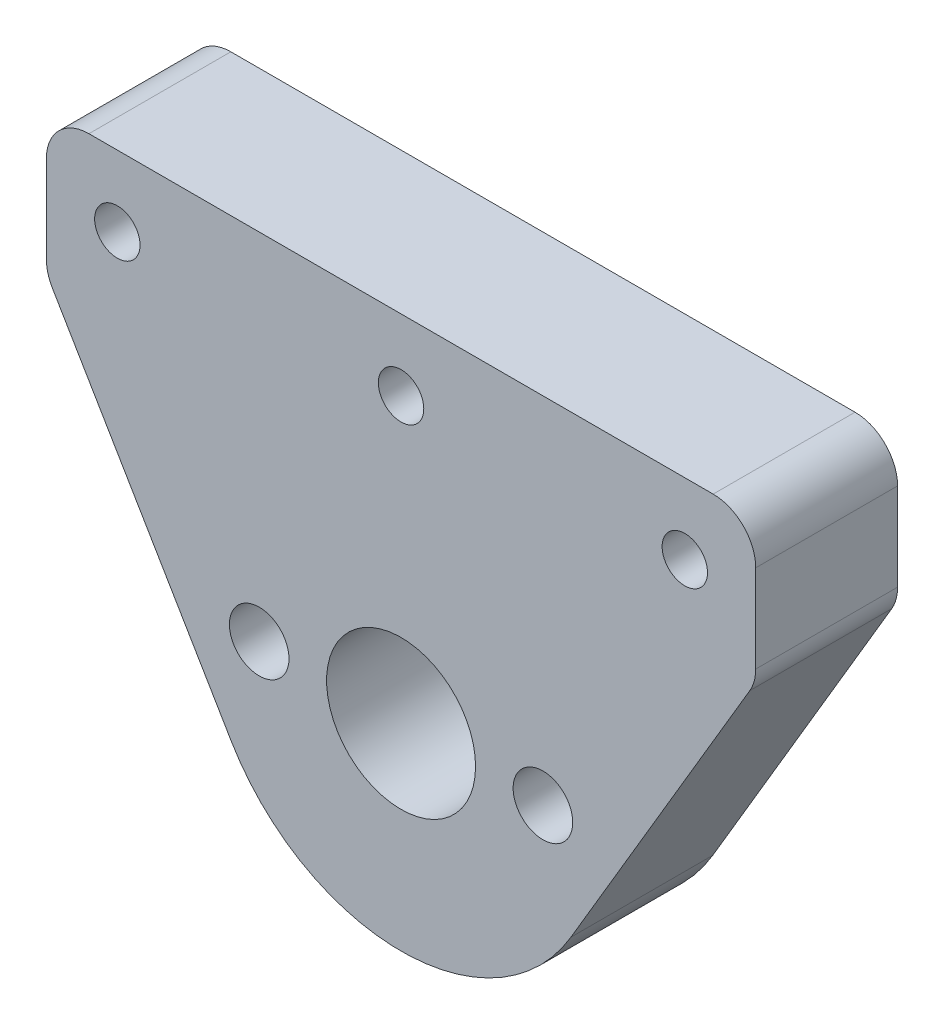
ISO-10303-21;
HEADER;
FILE_DESCRIPTION(('STEP AP214'),'2;1');
FILE_NAME('part.step','',(''),(''),'','','');
FILE_SCHEMA(('AUTOMOTIVE_DESIGN { 1 0 10303 214 1 1 1 1 }'));
ENDSEC;
DATA;
#1=APPLICATION_CONTEXT('core data for automotive mechanical design processes');
#2=APPLICATION_PROTOCOL_DEFINITION('international standard','automotive_design',2000,#1);
#3=PRODUCT_CONTEXT('',#1,'mechanical');
#4=PRODUCT('Part','Part','',(#3));
#5=PRODUCT_RELATED_PRODUCT_CATEGORY('part','',(#4));
#6=PRODUCT_DEFINITION_FORMATION('','',#4);
#7=PRODUCT_DEFINITION_CONTEXT('part definition',#1,'design');
#8=PRODUCT_DEFINITION('design','',#6,#7);
#9=PRODUCT_DEFINITION_SHAPE('','',#8);
#10=(LENGTH_UNIT() NAMED_UNIT(*) SI_UNIT(.MILLI.,.METRE.));
#11=(NAMED_UNIT(*) PLANE_ANGLE_UNIT() SI_UNIT($,.RADIAN.));
#12=(NAMED_UNIT(*) SI_UNIT($,.STERADIAN.) SOLID_ANGLE_UNIT());
#13=UNCERTAINTY_MEASURE_WITH_UNIT(LENGTH_MEASURE(1.E-05),#10,'distance_accuracy_value','');
#14=(GEOMETRIC_REPRESENTATION_CONTEXT(3) GLOBAL_UNCERTAINTY_ASSIGNED_CONTEXT((#13)) GLOBAL_UNIT_ASSIGNED_CONTEXT((#10,
#11,#12)) REPRESENTATION_CONTEXT('',''));
#15=CARTESIAN_POINT('',(0.,0.,0.));
#16=DIRECTION('',(0.,0.,1.));
#17=DIRECTION('',(1.,0.,0.));
#18=AXIS2_PLACEMENT_3D('',#15,#16,#17);
#19=CARTESIAN_POINT('',(0.,-20.,10.));
#20=DIRECTION('',(0.,0.,-1.));
#21=DIRECTION('',(-1.,0.,0.));
#22=AXIS2_PLACEMENT_3D('',#19,#20,#21);
#23=CYLINDRICAL_SURFACE('',#22,13.9);
#24=CARTESIAN_POINT('',(0.,-20.,0.));
#25=DIRECTION('',(0.,0.,1.));
#26=DIRECTION('',(1.,0.,0.));
#27=AXIS2_PLACEMENT_3D('',#24,#25,#26);
#28=CIRCLE('',#27,13.9);
#29=CARTESIAN_POINT('',(-11.9690237254858,-27.067706209143,0.));
#30=VERTEX_POINT('',#29);
#31=CARTESIAN_POINT('',(11.9690237254858,-27.067706209143,0.));
#32=VERTEX_POINT('',#31);
#33=EDGE_CURVE('E146',#30,#32,#28,.T.);
#34=ORIENTED_EDGE('',*,*,#33,.T.);
#35=DIRECTION('',(0.,0.,-1.));
#36=VECTOR('',#35,1.);
#37=CARTESIAN_POINT('',(11.9690237254858,-27.067706209143,10.));
#38=LINE('',#37,#36);
#39=CARTESIAN_POINT('',(11.9690237254858,-27.067706209143,10.));
#40=VERTEX_POINT('',#39);
#41=EDGE_CURVE('E125',#40,#32,#38,.T.);
#42=ORIENTED_EDGE('',*,*,#41,.F.);
#43=CARTESIAN_POINT('',(0.,-20.,10.));
#44=DIRECTION('',(0.,0.,1.));
#45=DIRECTION('',(1.,0.,0.));
#46=AXIS2_PLACEMENT_3D('',#43,#44,#45);
#47=CIRCLE('',#46,13.9);
#48=CARTESIAN_POINT('',(-11.9690237254858,-27.067706209143,10.));
#49=VERTEX_POINT('',#48);
#50=EDGE_CURVE('E131',#49,#40,#47,.T.);
#51=ORIENTED_EDGE('',*,*,#50,.F.);
#52=DIRECTION('',(0.,0.,-1.));
#53=VECTOR('',#52,1.);
#54=CARTESIAN_POINT('',(-11.9690237254858,-27.067706209143,10.));
#55=LINE('',#54,#53);
#56=EDGE_CURVE('E149',#49,#30,#55,.T.);
#57=ORIENTED_EDGE('',*,*,#56,.T.);
#58=EDGE_LOOP('',(#34,#42,#51,#57));
#59=FACE_BOUND('',#58,.T.);
#60=ADVANCED_FACE('F41',(#59),#23,.T.);
#61=CARTESIAN_POINT('',(20.7256660630455,-12.2385018262184,10.));
#62=DIRECTION('',(0.861080843560131,-0.50846807260021,0.));
#63=DIRECTION('',(0.50846807260021,0.861080843560131,0.));
#64=AXIS2_PLACEMENT_3D('',#61,#62,#63);
#65=PLANE('',#64);
#66=DIRECTION('',(-0.50846807260021,-0.861080843560131,0.));
#67=VECTOR('',#66,1.);
#68=CARTESIAN_POINT('',(20.7256660630455,-12.2385018262184,0.));
#69=LINE('',#68,#67);
#70=CARTESIAN_POINT('',(24.5832425306803,-5.70577071123963,0.));
#71=VERTEX_POINT('',#70);
#72=EDGE_CURVE('E229',#71,#32,#69,.T.);
#73=ORIENTED_EDGE('',*,*,#72,.F.);
#74=DIRECTION('',(0.,0.,-1.));
#75=VECTOR('',#74,1.);
#76=CARTESIAN_POINT('',(24.5832425306803,-5.70577071123963,10.));
#77=LINE('',#76,#75);
#78=CARTESIAN_POINT('',(24.5832425306803,-5.70577071123963,10.));
#79=VERTEX_POINT('',#78);
#80=EDGE_CURVE('E11',#71,#79,#77,.F.);
#81=ORIENTED_EDGE('',*,*,#80,.T.);
#82=DIRECTION('',(-0.50846807260021,-0.861080843560131,0.));
#83=VECTOR('',#82,1.);
#84=CARTESIAN_POINT('',(20.7256660630455,-12.2385018262184,10.));
#85=LINE('',#84,#83);
#86=EDGE_CURVE('E120',#79,#40,#85,.T.);
#87=ORIENTED_EDGE('',*,*,#86,.T.);
#88=ORIENTED_EDGE('',*,*,#41,.T.);
#89=EDGE_LOOP('',(#73,#81,#87,#88));
#90=FACE_BOUND('',#89,.T.);
#91=ADVANCED_FACE('F123',(#90),#65,.T.);
#92=CARTESIAN_POINT('',(24.9999999999999,0.,10.));
#93=DIRECTION('',(1.,0.,0.));
#94=DIRECTION('',(0.,1.,0.));
#95=AXIS2_PLACEMENT_3D('',#92,#93,#94);
#96=PLANE('',#95);
#97=DIRECTION('',(0.,-1.,0.));
#98=VECTOR('',#97,1.);
#99=CARTESIAN_POINT('',(24.9999999999999,0.,0.));
#100=LINE('',#99,#98);
#101=CARTESIAN_POINT('',(24.9999999999999,2.,0.));
#102=VERTEX_POINT('',#101);
#103=CARTESIAN_POINT('',(24.9999999999999,-4.180366493439,0.));
#104=VERTEX_POINT('',#103);
#105=EDGE_CURVE('E206',#102,#104,#100,.T.);
#106=ORIENTED_EDGE('',*,*,#105,.F.);
#107=DIRECTION('',(0.,0.,-1.));
#108=VECTOR('',#107,1.);
#109=CARTESIAN_POINT('',(24.9999999999999,2.,10.));
#110=LINE('',#109,#108);
#111=CARTESIAN_POINT('',(24.9999999999999,2.,10.));
#112=VERTEX_POINT('',#111);
#113=EDGE_CURVE('E50',#102,#112,#110,.F.);
#114=ORIENTED_EDGE('',*,*,#113,.T.);
#115=DIRECTION('',(0.,-1.,0.));
#116=VECTOR('',#115,1.);
#117=CARTESIAN_POINT('',(24.9999999999999,0.,10.));
#118=LINE('',#117,#116);
#119=CARTESIAN_POINT('',(24.9999999999999,-4.180366493439,10.));
#120=VERTEX_POINT('',#119);
#121=EDGE_CURVE('E130',#112,#120,#118,.T.);
#122=ORIENTED_EDGE('',*,*,#121,.T.);
#123=DIRECTION('',(0.,0.,-1.));
#124=VECTOR('',#123,1.);
#125=CARTESIAN_POINT('',(24.9999999999999,-4.180366493439,10.));
#126=LINE('',#125,#124);
#127=EDGE_CURVE('E195',#120,#104,#126,.T.);
#128=ORIENTED_EDGE('',*,*,#127,.T.);
#129=EDGE_LOOP('',(#106,#114,#122,#128));
#130=FACE_BOUND('',#129,.T.);
#131=ADVANCED_FACE('F203',(#130),#96,.T.);
#132=CARTESIAN_POINT('',(0.,5.,10.));
#133=DIRECTION('',(0.,-1.,0.));
#134=DIRECTION('',(1.,0.,0.));
#135=AXIS2_PLACEMENT_3D('',#132,#133,#134);
#136=PLANE('',#135);
#137=DIRECTION('',(-1.,0.,0.));
#138=VECTOR('',#137,1.);
#139=CARTESIAN_POINT('',(0.,5.,0.));
#140=LINE('',#139,#138);
#141=CARTESIAN_POINT('',(21.9999999999999,5.,0.));
#142=VERTEX_POINT('',#141);
#143=CARTESIAN_POINT('',(-22.,5.,0.));
#144=VERTEX_POINT('',#143);
#145=EDGE_CURVE('E215',#142,#144,#140,.T.);
#146=ORIENTED_EDGE('',*,*,#145,.T.);
#147=DIRECTION('',(0.,0.,-1.));
#148=VECTOR('',#147,1.);
#149=CARTESIAN_POINT('',(-22.,5.,10.));
#150=LINE('',#149,#148);
#151=CARTESIAN_POINT('',(-22.,5.,10.));
#152=VERTEX_POINT('',#151);
#153=EDGE_CURVE('E57',#144,#152,#150,.F.);
#154=ORIENTED_EDGE('',*,*,#153,.T.);
#155=DIRECTION('',(-1.,0.,0.));
#156=VECTOR('',#155,1.);
#157=CARTESIAN_POINT('',(0.,5.,10.));
#158=LINE('',#157,#156);
#159=CARTESIAN_POINT('',(21.9999999999999,5.,10.));
#160=VERTEX_POINT('',#159);
#161=EDGE_CURVE('E209',#160,#152,#158,.T.);
#162=ORIENTED_EDGE('',*,*,#161,.F.);
#163=DIRECTION('',(0.,0.,-1.));
#164=VECTOR('',#163,1.);
#165=CARTESIAN_POINT('',(21.9999999999999,5.,0.));
#166=LINE('',#165,#164);
#167=EDGE_CURVE('E189',#160,#142,#166,.T.);
#168=ORIENTED_EDGE('',*,*,#167,.T.);
#169=EDGE_LOOP('',(#146,#154,#162,#168));
#170=FACE_BOUND('',#169,.T.);
#171=ADVANCED_FACE('F214',(#170),#136,.F.);
#172=CARTESIAN_POINT('',(-25.,0.,10.));
#173=DIRECTION('',(1.,0.,0.));
#174=DIRECTION('',(0.,1.,0.));
#175=AXIS2_PLACEMENT_3D('',#172,#173,#174);
#176=PLANE('',#175);
#177=DIRECTION('',(0.,-1.,0.));
#178=VECTOR('',#177,1.);
#179=CARTESIAN_POINT('',(-25.,0.,0.));
#180=LINE('',#179,#178);
#181=CARTESIAN_POINT('',(-25.,2.,0.));
#182=VERTEX_POINT('',#181);
#183=CARTESIAN_POINT('',(-25.,-4.18036649343903,0.));
#184=VERTEX_POINT('',#183);
#185=EDGE_CURVE('E222',#182,#184,#180,.T.);
#186=ORIENTED_EDGE('',*,*,#185,.T.);
#187=DIRECTION('',(0.,0.,-1.));
#188=VECTOR('',#187,1.);
#189=CARTESIAN_POINT('',(-25.,-4.18036649343903,10.));
#190=LINE('',#189,#188);
#191=CARTESIAN_POINT('',(-25.,-4.18036649343903,10.));
#192=VERTEX_POINT('',#191);
#193=EDGE_CURVE('E175',#184,#192,#190,.F.);
#194=ORIENTED_EDGE('',*,*,#193,.T.);
#195=DIRECTION('',(0.,-1.,0.));
#196=VECTOR('',#195,1.);
#197=CARTESIAN_POINT('',(-25.,0.,10.));
#198=LINE('',#197,#196);
#199=CARTESIAN_POINT('',(-25.,2.,10.));
#200=VERTEX_POINT('',#199);
#201=EDGE_CURVE('E318',#200,#192,#198,.T.);
#202=ORIENTED_EDGE('',*,*,#201,.F.);
#203=DIRECTION('',(0.,0.,-1.));
#204=VECTOR('',#203,1.);
#205=CARTESIAN_POINT('',(-25.,2.,10.));
#206=LINE('',#205,#204);
#207=EDGE_CURVE('E171',#200,#182,#206,.T.);
#208=ORIENTED_EDGE('',*,*,#207,.T.);
#209=EDGE_LOOP('',(#186,#194,#202,#208));
#210=FACE_BOUND('',#209,.T.);
#211=ADVANCED_FACE('F335',(#210),#176,.F.);
#212=CARTESIAN_POINT('',(-20.,0.,10.));
#213=DIRECTION('',(0.,0.,-1.));
#214=DIRECTION('',(-1.,0.,0.));
#215=AXIS2_PLACEMENT_3D('',#212,#213,#214);
#216=CYLINDRICAL_SURFACE('',#215,1.6);
#217=CARTESIAN_POINT('',(-20.,0.,10.));
#218=DIRECTION('',(0.,0.,1.));
#219=DIRECTION('',(1.,0.,0.));
#220=AXIS2_PLACEMENT_3D('',#217,#218,#219);
#221=CIRCLE('',#220,1.6);
#222=CARTESIAN_POINT('',(-18.4,0.,10.));
#223=VERTEX_POINT('',#222);
#224=EDGE_CURVE('E300',#223,#223,#221,.T.);
#225=ORIENTED_EDGE('',*,*,#224,.T.);
#226=EDGE_LOOP('',(#225));
#227=FACE_BOUND('',#226,.T.);
#228=CARTESIAN_POINT('',(-20.,0.,0.));
#229=DIRECTION('',(0.,0.,1.));
#230=DIRECTION('',(1.,0.,0.));
#231=AXIS2_PLACEMENT_3D('',#228,#229,#230);
#232=CIRCLE('',#231,1.6);
#233=CARTESIAN_POINT('',(-18.4,0.,0.));
#234=VERTEX_POINT('',#233);
#235=EDGE_CURVE('E247',#234,#234,#232,.T.);
#236=ORIENTED_EDGE('',*,*,#235,.F.);
#237=EDGE_LOOP('',(#236));
#238=FACE_BOUND('',#237,.T.);
#239=ADVANCED_FACE('F356',(#227,#238),#216,.F.);
#240=CARTESIAN_POINT('',(0.,0.,10.));
#241=DIRECTION('',(0.,0.,-1.));
#242=DIRECTION('',(-1.,0.,0.));
#243=AXIS2_PLACEMENT_3D('',#240,#241,#242);
#244=CYLINDRICAL_SURFACE('',#243,1.6);
#245=CARTESIAN_POINT('',(0.,0.,10.));
#246=DIRECTION('',(0.,0.,1.));
#247=DIRECTION('',(1.,0.,0.));
#248=AXIS2_PLACEMENT_3D('',#245,#246,#247);
#249=CIRCLE('',#248,1.6);
#250=CARTESIAN_POINT('',(1.6,0.,10.));
#251=VERTEX_POINT('',#250);
#252=EDGE_CURVE('E304',#251,#251,#249,.T.);
#253=ORIENTED_EDGE('',*,*,#252,.T.);
#254=EDGE_LOOP('',(#253));
#255=FACE_BOUND('',#254,.T.);
#256=CARTESIAN_POINT('',(0.,0.,0.));
#257=DIRECTION('',(0.,0.,1.));
#258=DIRECTION('',(1.,0.,0.));
#259=AXIS2_PLACEMENT_3D('',#256,#257,#258);
#260=CIRCLE('',#259,1.6);
#261=CARTESIAN_POINT('',(1.6,0.,0.));
#262=VERTEX_POINT('',#261);
#263=EDGE_CURVE('E243',#262,#262,#260,.T.);
#264=ORIENTED_EDGE('',*,*,#263,.F.);
#265=EDGE_LOOP('',(#264));
#266=FACE_BOUND('',#265,.T.);
#267=ADVANCED_FACE('F377',(#255,#266),#244,.F.);
#268=CARTESIAN_POINT('',(10.,-20.,10.));
#269=DIRECTION('',(0.,0.,-1.));
#270=DIRECTION('',(-1.,0.,0.));
#271=AXIS2_PLACEMENT_3D('',#268,#269,#270);
#272=CYLINDRICAL_SURFACE('',#271,2.1);
#273=CARTESIAN_POINT('',(10.,-20.,10.));
#274=DIRECTION('',(0.,0.,1.));
#275=DIRECTION('',(1.,0.,0.));
#276=AXIS2_PLACEMENT_3D('',#273,#274,#275);
#277=CIRCLE('',#276,2.1);
#278=CARTESIAN_POINT('',(12.1,-20.,10.));
#279=VERTEX_POINT('',#278);
#280=EDGE_CURVE('E308',#279,#279,#277,.F.);
#281=ORIENTED_EDGE('',*,*,#280,.F.);
#282=EDGE_LOOP('',(#281));
#283=FACE_BOUND('',#282,.T.);
#284=CARTESIAN_POINT('',(10.,-20.,0.));
#285=DIRECTION('',(0.,0.,1.));
#286=DIRECTION('',(1.,0.,0.));
#287=AXIS2_PLACEMENT_3D('',#284,#285,#286);
#288=CIRCLE('',#287,2.1);
#289=CARTESIAN_POINT('',(12.1,-20.,0.));
#290=VERTEX_POINT('',#289);
#291=EDGE_CURVE('E239',#290,#290,#288,.F.);
#292=ORIENTED_EDGE('',*,*,#291,.T.);
#293=EDGE_LOOP('',(#292));
#294=FACE_BOUND('',#293,.T.);
#295=ADVANCED_FACE('F349',(#283,#294),#272,.F.);
#296=CARTESIAN_POINT('',(-10.,-20.,10.));
#297=DIRECTION('',(0.,0.,-1.));
#298=DIRECTION('',(-1.,0.,0.));
#299=AXIS2_PLACEMENT_3D('',#296,#297,#298);
#300=CYLINDRICAL_SURFACE('',#299,2.1);
#301=CARTESIAN_POINT('',(-10.,-20.,10.));
#302=DIRECTION('',(0.,0.,1.));
#303=DIRECTION('',(1.,0.,0.));
#304=AXIS2_PLACEMENT_3D('',#301,#302,#303);
#305=CIRCLE('',#304,2.1);
#306=CARTESIAN_POINT('',(-7.9,-20.,10.));
#307=VERTEX_POINT('',#306);
#308=EDGE_CURVE('E312',#307,#307,#305,.T.);
#309=ORIENTED_EDGE('',*,*,#308,.T.);
#310=EDGE_LOOP('',(#309));
#311=FACE_BOUND('',#310,.T.);
#312=CARTESIAN_POINT('',(-10.,-20.,0.));
#313=DIRECTION('',(0.,0.,1.));
#314=DIRECTION('',(1.,0.,0.));
#315=AXIS2_PLACEMENT_3D('',#312,#313,#314);
#316=CIRCLE('',#315,2.1);
#317=CARTESIAN_POINT('',(-7.9,-20.,0.));
#318=VERTEX_POINT('',#317);
#319=EDGE_CURVE('E235',#318,#318,#316,.T.);
#320=ORIENTED_EDGE('',*,*,#319,.F.);
#321=EDGE_LOOP('',(#320));
#322=FACE_BOUND('',#321,.T.);
#323=ADVANCED_FACE('F342',(#311,#322),#300,.F.);
#324=CARTESIAN_POINT('',(-20.7256660630455,-12.2385018262185,10.));
#325=DIRECTION('',(0.861080843560129,0.508468072600214,0.));
#326=DIRECTION('',(-0.508468072600214,0.861080843560129,0.));
#327=AXIS2_PLACEMENT_3D('',#324,#325,#326);
#328=PLANE('',#327);
#329=DIRECTION('',(0.508468072600214,-0.861080843560129,0.));
#330=VECTOR('',#329,1.);
#331=CARTESIAN_POINT('',(-20.7256660630455,-12.2385018262185,10.));
#332=LINE('',#331,#330);
#333=CARTESIAN_POINT('',(-24.5832425306804,-5.70577071123967,10.));
#334=VERTEX_POINT('',#333);
#335=EDGE_CURVE('E138',#334,#49,#332,.T.);
#336=ORIENTED_EDGE('',*,*,#335,.F.);
#337=DIRECTION('',(0.,0.,-1.));
#338=VECTOR('',#337,1.);
#339=CARTESIAN_POINT('',(-24.5832425306804,-5.70577071123967,10.));
#340=LINE('',#339,#338);
#341=CARTESIAN_POINT('',(-24.5832425306804,-5.70577071123967,0.));
#342=VERTEX_POINT('',#341);
#343=EDGE_CURVE('E148',#334,#342,#340,.T.);
#344=ORIENTED_EDGE('',*,*,#343,.T.);
#345=DIRECTION('',(0.508468072600214,-0.861080843560129,0.));
#346=VECTOR('',#345,1.);
#347=CARTESIAN_POINT('',(-20.7256660630455,-12.2385018262185,0.));
#348=LINE('',#347,#346);
#349=EDGE_CURVE('E227',#342,#30,#348,.T.);
#350=ORIENTED_EDGE('',*,*,#349,.T.);
#351=ORIENTED_EDGE('',*,*,#56,.F.);
#352=EDGE_LOOP('',(#336,#344,#350,#351));
#353=FACE_BOUND('',#352,.T.);
#354=ADVANCED_FACE('F340',(#353),#328,.F.);
#355=CARTESIAN_POINT('',(20.,0.,10.));
#356=DIRECTION('',(0.,0.,-1.));
#357=DIRECTION('',(-1.,0.,0.));
#358=AXIS2_PLACEMENT_3D('',#355,#356,#357);
#359=CYLINDRICAL_SURFACE('',#358,1.6);
#360=CARTESIAN_POINT('',(20.,0.,10.));
#361=DIRECTION('',(0.,0.,1.));
#362=DIRECTION('',(1.,0.,0.));
#363=AXIS2_PLACEMENT_3D('',#360,#361,#362);
#364=CIRCLE('',#363,1.6);
#365=CARTESIAN_POINT('',(21.6,0.,10.));
#366=VERTEX_POINT('',#365);
#367=EDGE_CURVE('E156',#366,#366,#364,.F.);
#368=ORIENTED_EDGE('',*,*,#367,.F.);
#369=EDGE_LOOP('',(#368));
#370=FACE_BOUND('',#369,.T.);
#371=CARTESIAN_POINT('',(20.,0.,0.));
#372=DIRECTION('',(0.,0.,1.));
#373=DIRECTION('',(1.,0.,0.));
#374=AXIS2_PLACEMENT_3D('',#371,#372,#373);
#375=CIRCLE('',#374,1.6);
#376=CARTESIAN_POINT('',(21.6,0.,0.));
#377=VERTEX_POINT('',#376);
#378=EDGE_CURVE('E143',#377,#377,#375,.F.);
#379=ORIENTED_EDGE('',*,*,#378,.T.);
#380=EDGE_LOOP('',(#379));
#381=FACE_BOUND('',#380,.T.);
#382=ADVANCED_FACE('F254',(#370,#381),#359,.F.);
#383=CARTESIAN_POINT('',(0.,0.,10.));
#384=DIRECTION('',(0.,0.,1.));
#385=DIRECTION('',(1.,0.,0.));
#386=AXIS2_PLACEMENT_3D('',#383,#384,#385);
#387=PLANE('',#386);
#388=CARTESIAN_POINT('',(0.,-20.,10.));
#389=DIRECTION('',(0.,0.,1.));
#390=DIRECTION('',(1.,0.,0.));
#391=AXIS2_PLACEMENT_3D('',#388,#389,#390);
#392=CIRCLE('',#391,5.25);
#393=CARTESIAN_POINT('',(5.25,-20.,10.));
#394=VERTEX_POINT('',#393);
#395=EDGE_CURVE('E323',#394,#394,#392,.T.);
#396=ORIENTED_EDGE('',*,*,#395,.F.);
#397=EDGE_LOOP('',(#396));
#398=FACE_BOUND('',#397,.T.);
#399=ORIENTED_EDGE('',*,*,#201,.T.);
#400=CARTESIAN_POINT('',(-22.,-4.18036649343903,10.));
#401=DIRECTION('',(0.,0.,1.));
#402=DIRECTION('',(1.,0.,0.));
#403=AXIS2_PLACEMENT_3D('',#400,#401,#402);
#404=CIRCLE('',#403,3.);
#405=EDGE_CURVE('E186',#192,#334,#404,.T.);
#406=ORIENTED_EDGE('',*,*,#405,.T.);
#407=ORIENTED_EDGE('',*,*,#335,.T.);
#408=ORIENTED_EDGE('',*,*,#50,.T.);
#409=ORIENTED_EDGE('',*,*,#86,.F.);
#410=CARTESIAN_POINT('',(21.9999999999999,-4.180366493439,10.));
#411=DIRECTION('',(0.,0.,1.));
#412=DIRECTION('',(1.,0.,0.));
#413=AXIS2_PLACEMENT_3D('',#410,#411,#412);
#414=CIRCLE('',#413,3.);
#415=EDGE_CURVE('E178',#79,#120,#414,.T.);
#416=ORIENTED_EDGE('',*,*,#415,.T.);
#417=ORIENTED_EDGE('',*,*,#121,.F.);
#418=CARTESIAN_POINT('',(21.9999999999999,2.,10.));
#419=DIRECTION('',(0.,0.,1.));
#420=DIRECTION('',(1.,0.,0.));
#421=AXIS2_PLACEMENT_3D('',#418,#419,#420);
#422=CIRCLE('',#421,3.);
#423=EDGE_CURVE('E64',#112,#160,#422,.T.);
#424=ORIENTED_EDGE('',*,*,#423,.T.);
#425=ORIENTED_EDGE('',*,*,#161,.T.);
#426=CARTESIAN_POINT('',(-22.,2.,10.));
#427=DIRECTION('',(0.,0.,1.));
#428=DIRECTION('',(1.,0.,0.));
#429=AXIS2_PLACEMENT_3D('',#426,#427,#428);
#430=CIRCLE('',#429,3.);
#431=EDGE_CURVE('E183',#152,#200,#430,.T.);
#432=ORIENTED_EDGE('',*,*,#431,.T.);
#433=EDGE_LOOP('',(#399,#406,#407,#408,#409,#416,#417,#424,#425,#432));
#434=FACE_BOUND('',#433,.T.);
#435=ORIENTED_EDGE('',*,*,#308,.F.);
#436=EDGE_LOOP('',(#435));
#437=FACE_BOUND('',#436,.T.);
#438=ORIENTED_EDGE('',*,*,#280,.T.);
#439=EDGE_LOOP('',(#438));
#440=FACE_BOUND('',#439,.T.);
#441=ORIENTED_EDGE('',*,*,#252,.F.);
#442=EDGE_LOOP('',(#441));
#443=FACE_BOUND('',#442,.T.);
#444=ORIENTED_EDGE('',*,*,#224,.F.);
#445=EDGE_LOOP('',(#444));
#446=FACE_BOUND('',#445,.T.);
#447=ORIENTED_EDGE('',*,*,#367,.T.);
#448=EDGE_LOOP('',(#447));
#449=FACE_BOUND('',#448,.T.);
#450=ADVANCED_FACE('F135',(#398,#434,#437,#440,#443,#446,#449),#387,.T.);
#451=CARTESIAN_POINT('',(0.,0.,0.));
#452=DIRECTION('',(0.,0.,1.));
#453=DIRECTION('',(1.,0.,0.));
#454=AXIS2_PLACEMENT_3D('',#451,#452,#453);
#455=PLANE('',#454);
#456=CARTESIAN_POINT('',(0.,-20.,0.));
#457=DIRECTION('',(0.,0.,1.));
#458=DIRECTION('',(1.,0.,0.));
#459=AXIS2_PLACEMENT_3D('',#456,#457,#458);
#460=CIRCLE('',#459,5.25);
#461=CARTESIAN_POINT('',(5.25,-20.,0.));
#462=VERTEX_POINT('',#461);
#463=EDGE_CURVE('E294',#462,#462,#460,.T.);
#464=ORIENTED_EDGE('',*,*,#463,.T.);
#465=EDGE_LOOP('',(#464));
#466=FACE_BOUND('',#465,.T.);
#467=ORIENTED_EDGE('',*,*,#349,.F.);
#468=CARTESIAN_POINT('',(-22.,-4.18036649343903,0.));
#469=DIRECTION('',(0.,0.,1.));
#470=DIRECTION('',(1.,0.,0.));
#471=AXIS2_PLACEMENT_3D('',#468,#469,#470);
#472=CIRCLE('',#471,3.);
#473=EDGE_CURVE('E168',#342,#184,#472,.F.);
#474=ORIENTED_EDGE('',*,*,#473,.T.);
#475=ORIENTED_EDGE('',*,*,#185,.F.);
#476=CARTESIAN_POINT('',(-22.,2.,0.));
#477=DIRECTION('',(0.,0.,1.));
#478=DIRECTION('',(1.,0.,0.));
#479=AXIS2_PLACEMENT_3D('',#476,#477,#478);
#480=CIRCLE('',#479,3.);
#481=EDGE_CURVE('E165',#182,#144,#480,.F.);
#482=ORIENTED_EDGE('',*,*,#481,.T.);
#483=ORIENTED_EDGE('',*,*,#145,.F.);
#484=CARTESIAN_POINT('',(21.9999999999999,2.,0.));
#485=DIRECTION('',(0.,0.,1.));
#486=DIRECTION('',(1.,0.,0.));
#487=AXIS2_PLACEMENT_3D('',#484,#485,#486);
#488=CIRCLE('',#487,3.);
#489=EDGE_CURVE('E162',#142,#102,#488,.F.);
#490=ORIENTED_EDGE('',*,*,#489,.T.);
#491=ORIENTED_EDGE('',*,*,#105,.T.);
#492=CARTESIAN_POINT('',(21.9999999999999,-4.180366493439,0.));
#493=DIRECTION('',(0.,0.,1.));
#494=DIRECTION('',(1.,0.,0.));
#495=AXIS2_PLACEMENT_3D('',#492,#493,#494);
#496=CIRCLE('',#495,3.);
#497=EDGE_CURVE('E154',#104,#71,#496,.F.);
#498=ORIENTED_EDGE('',*,*,#497,.T.);
#499=ORIENTED_EDGE('',*,*,#72,.T.);
#500=ORIENTED_EDGE('',*,*,#33,.F.);
#501=EDGE_LOOP('',(#467,#474,#475,#482,#483,#490,#491,#498,#499,#500));
#502=FACE_BOUND('',#501,.T.);
#503=ORIENTED_EDGE('',*,*,#319,.T.);
#504=EDGE_LOOP('',(#503));
#505=FACE_BOUND('',#504,.T.);
#506=ORIENTED_EDGE('',*,*,#291,.F.);
#507=EDGE_LOOP('',(#506));
#508=FACE_BOUND('',#507,.T.);
#509=ORIENTED_EDGE('',*,*,#263,.T.);
#510=EDGE_LOOP('',(#509));
#511=FACE_BOUND('',#510,.T.);
#512=ORIENTED_EDGE('',*,*,#235,.T.);
#513=EDGE_LOOP('',(#512));
#514=FACE_BOUND('',#513,.T.);
#515=ORIENTED_EDGE('',*,*,#378,.F.);
#516=EDGE_LOOP('',(#515));
#517=FACE_BOUND('',#516,.T.);
#518=ADVANCED_FACE('F218',(#466,#502,#505,#508,#511,#514,#517),#455,.F.);
#519=CARTESIAN_POINT('',(-22.,-4.18036649343903,10.));
#520=DIRECTION('',(0.,0.,-1.));
#521=DIRECTION('',(-1.,0.,0.));
#522=AXIS2_PLACEMENT_3D('',#519,#520,#521);
#523=CYLINDRICAL_SURFACE('',#522,3.);
#524=ORIENTED_EDGE('',*,*,#405,.F.);
#525=ORIENTED_EDGE('',*,*,#193,.F.);
#526=ORIENTED_EDGE('',*,*,#473,.F.);
#527=ORIENTED_EDGE('',*,*,#343,.F.);
#528=EDGE_LOOP('',(#524,#525,#526,#527));
#529=FACE_BOUND('',#528,.T.);
#530=ADVANCED_FACE('F257',(#529),#523,.T.);
#531=CARTESIAN_POINT('',(-22.,2.,10.));
#532=DIRECTION('',(0.,0.,-1.));
#533=DIRECTION('',(-1.,0.,0.));
#534=AXIS2_PLACEMENT_3D('',#531,#532,#533);
#535=CYLINDRICAL_SURFACE('',#534,3.);
#536=ORIENTED_EDGE('',*,*,#431,.F.);
#537=ORIENTED_EDGE('',*,*,#153,.F.);
#538=ORIENTED_EDGE('',*,*,#481,.F.);
#539=ORIENTED_EDGE('',*,*,#207,.F.);
#540=EDGE_LOOP('',(#536,#537,#538,#539));
#541=FACE_BOUND('',#540,.T.);
#542=ADVANCED_FACE('F264',(#541),#535,.T.);
#543=CARTESIAN_POINT('',(21.9999999999999,2.,10.));
#544=DIRECTION('',(0.,0.,1.));
#545=DIRECTION('',(1.,0.,0.));
#546=AXIS2_PLACEMENT_3D('',#543,#544,#545);
#547=CYLINDRICAL_SURFACE('',#546,3.);
#548=ORIENTED_EDGE('',*,*,#423,.F.);
#549=ORIENTED_EDGE('',*,*,#113,.F.);
#550=ORIENTED_EDGE('',*,*,#489,.F.);
#551=ORIENTED_EDGE('',*,*,#167,.F.);
#552=EDGE_LOOP('',(#548,#549,#550,#551));
#553=FACE_BOUND('',#552,.T.);
#554=ADVANCED_FACE('F212',(#553),#547,.T.);
#555=CARTESIAN_POINT('',(21.9999999999999,-4.180366493439,10.));
#556=DIRECTION('',(0.,0.,-1.));
#557=DIRECTION('',(-1.,0.,0.));
#558=AXIS2_PLACEMENT_3D('',#555,#556,#557);
#559=CYLINDRICAL_SURFACE('',#558,3.);
#560=ORIENTED_EDGE('',*,*,#415,.F.);
#561=ORIENTED_EDGE('',*,*,#80,.F.);
#562=ORIENTED_EDGE('',*,*,#497,.F.);
#563=ORIENTED_EDGE('',*,*,#127,.F.);
#564=EDGE_LOOP('',(#560,#561,#562,#563));
#565=FACE_BOUND('',#564,.T.);
#566=ADVANCED_FACE('F43',(#565),#559,.T.);
#567=CARTESIAN_POINT('',(0.,-20.,0.));
#568=DIRECTION('',(0.,0.,1.));
#569=DIRECTION('',(1.,0.,0.));
#570=AXIS2_PLACEMENT_3D('',#567,#568,#569);
#571=CYLINDRICAL_SURFACE('',#570,5.25);
#572=ORIENTED_EDGE('',*,*,#463,.F.);
#573=EDGE_LOOP('',(#572));
#574=FACE_BOUND('',#573,.T.);
#575=ORIENTED_EDGE('',*,*,#395,.T.);
#576=EDGE_LOOP('',(#575));
#577=FACE_BOUND('',#576,.T.);
#578=ADVANCED_FACE('F285',(#574,#577),#571,.F.);
#579=CLOSED_SHELL('',(#60,#91,#131,#171,#211,#239,#267,#295,#323,#354,#382,#450,#518,#530,#542,
#554,#566,#578));
#580=MANIFOLD_SOLID_BREP('B2',#579);
#581=ADVANCED_BREP_SHAPE_REPRESENTATION('',(#18,#580),#14);
#582=SHAPE_DEFINITION_REPRESENTATION(#9,#581);
ENDSEC;
END-ISO-10303-21;
